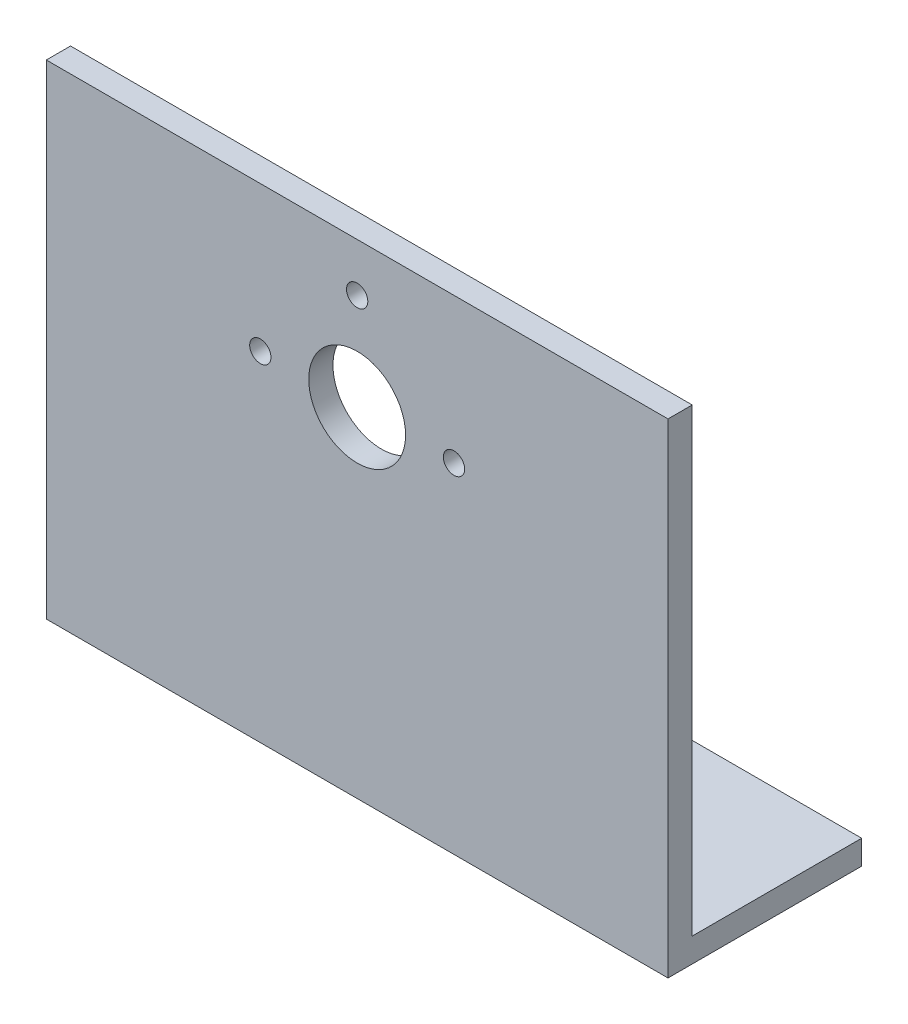
ISO-10303-21;
HEADER;
FILE_DESCRIPTION(('STEP AP214'),'2;1');
FILE_NAME('part.step','',(''),(''),'','','');
FILE_SCHEMA(('AUTOMOTIVE_DESIGN { 1 0 10303 214 1 1 1 1 }'));
ENDSEC;
DATA;
#1=APPLICATION_CONTEXT('core data for automotive mechanical design processes');
#2=APPLICATION_PROTOCOL_DEFINITION('international standard','automotive_design',2000,#1);
#3=PRODUCT_CONTEXT('',#1,'mechanical');
#4=PRODUCT('Part','Part','',(#3));
#5=PRODUCT_RELATED_PRODUCT_CATEGORY('part','',(#4));
#6=PRODUCT_DEFINITION_FORMATION('','',#4);
#7=PRODUCT_DEFINITION_CONTEXT('part definition',#1,'design');
#8=PRODUCT_DEFINITION('design','',#6,#7);
#9=PRODUCT_DEFINITION_SHAPE('','',#8);
#10=(LENGTH_UNIT() NAMED_UNIT(*) SI_UNIT(.MILLI.,.METRE.));
#11=(NAMED_UNIT(*) PLANE_ANGLE_UNIT() SI_UNIT($,.RADIAN.));
#12=(NAMED_UNIT(*) SI_UNIT($,.STERADIAN.) SOLID_ANGLE_UNIT());
#13=UNCERTAINTY_MEASURE_WITH_UNIT(LENGTH_MEASURE(1.E-05),#10,'distance_accuracy_value','');
#14=(GEOMETRIC_REPRESENTATION_CONTEXT(3) GLOBAL_UNCERTAINTY_ASSIGNED_CONTEXT((#13)) GLOBAL_UNIT_ASSIGNED_CONTEXT((#10,
#11,#12)) REPRESENTATION_CONTEXT('',''));
#15=CARTESIAN_POINT('',(0.,0.,0.));
#16=DIRECTION('',(0.,0.,1.));
#17=DIRECTION('',(1.,0.,0.));
#18=AXIS2_PLACEMENT_3D('',#15,#16,#17);
#19=CARTESIAN_POINT('',(-40.7657771127717,-44.45,3.175));
#20=DIRECTION('',(0.,0.,-1.));
#21=DIRECTION('',(-1.,0.,0.));
#22=AXIS2_PLACEMENT_3D('',#19,#20,#21);
#23=PLANE('',#22);
#24=CARTESIAN_POINT('',(-12.7,0.,3.175));
#25=DIRECTION('',(0.,0.,1.));
#26=DIRECTION('',(1.,0.,0.));
#27=AXIS2_PLACEMENT_3D('',#24,#25,#26);
#28=CIRCLE('',#27,1.397);
#29=CARTESIAN_POINT('',(-11.303,0.,3.175));
#30=VERTEX_POINT('',#29);
#31=EDGE_CURVE('E149',#30,#30,#28,.T.);
#32=ORIENTED_EDGE('',*,*,#31,.F.);
#33=EDGE_LOOP('',(#32));
#34=FACE_BOUND('',#33,.T.);
#35=CARTESIAN_POINT('',(0.,0.,3.175));
#36=DIRECTION('',(0.,0.,1.));
#37=DIRECTION('',(1.,0.,0.));
#38=AXIS2_PLACEMENT_3D('',#35,#36,#37);
#39=CIRCLE('',#38,6.35);
#40=CARTESIAN_POINT('',(6.35,0.,3.175));
#41=VERTEX_POINT('',#40);
#42=EDGE_CURVE('E161',#41,#41,#39,.T.);
#43=ORIENTED_EDGE('',*,*,#42,.F.);
#44=EDGE_LOOP('',(#43));
#45=FACE_BOUND('',#44,.T.);
#46=DIRECTION('',(0.,-1.,0.));
#47=VECTOR('',#46,1.);
#48=CARTESIAN_POINT('',(-40.7657771127717,19.0500000000001,3.175));
#49=LINE('',#48,#47);
#50=CARTESIAN_POINT('',(-40.7657771127717,19.0500000000001,3.175));
#51=VERTEX_POINT('',#50);
#52=CARTESIAN_POINT('',(-40.7657771127717,-44.45,3.175));
#53=VERTEX_POINT('',#52);
#54=EDGE_CURVE('E167',#51,#53,#49,.T.);
#55=ORIENTED_EDGE('',*,*,#54,.T.);
#56=DIRECTION('',(1.,0.,0.));
#57=VECTOR('',#56,1.);
#58=CARTESIAN_POINT('',(40.7657771127717,-44.45,3.175));
#59=LINE('',#58,#57);
#60=CARTESIAN_POINT('',(40.7657771127717,-44.45,3.175));
#61=VERTEX_POINT('',#60);
#62=EDGE_CURVE('E81',#53,#61,#59,.T.);
#63=ORIENTED_EDGE('',*,*,#62,.T.);
#64=DIRECTION('',(0.,1.,0.));
#65=VECTOR('',#64,1.);
#66=CARTESIAN_POINT('',(40.7657771127717,19.0500000000001,3.175));
#67=LINE('',#66,#65);
#68=CARTESIAN_POINT('',(40.7657771127717,19.0500000000001,3.175));
#69=VERTEX_POINT('',#68);
#70=EDGE_CURVE('E103',#61,#69,#67,.T.);
#71=ORIENTED_EDGE('',*,*,#70,.T.);
#72=DIRECTION('',(-1.,0.,0.));
#73=VECTOR('',#72,1.);
#74=CARTESIAN_POINT('',(40.7657771127717,19.0500000000001,3.175));
#75=LINE('',#74,#73);
#76=EDGE_CURVE('E59',#69,#51,#75,.T.);
#77=ORIENTED_EDGE('',*,*,#76,.T.);
#78=EDGE_LOOP('',(#55,#63,#71,#77));
#79=FACE_BOUND('',#78,.T.);
#80=CARTESIAN_POINT('',(0.,12.7,3.175));
#81=DIRECTION('',(0.,0.,1.));
#82=DIRECTION('',(1.,0.,0.));
#83=AXIS2_PLACEMENT_3D('',#80,#81,#82);
#84=CIRCLE('',#83,1.397);
#85=CARTESIAN_POINT('',(1.397,12.7,3.175));
#86=VERTEX_POINT('',#85);
#87=EDGE_CURVE('E155',#86,#86,#84,.T.);
#88=ORIENTED_EDGE('',*,*,#87,.F.);
#89=EDGE_LOOP('',(#88));
#90=FACE_BOUND('',#89,.T.);
#91=CARTESIAN_POINT('',(12.7,0.,3.175));
#92=DIRECTION('',(0.,0.,1.));
#93=DIRECTION('',(1.,0.,0.));
#94=AXIS2_PLACEMENT_3D('',#91,#92,#93);
#95=CIRCLE('',#94,1.397);
#96=CARTESIAN_POINT('',(14.097,0.,3.175));
#97=VERTEX_POINT('',#96);
#98=EDGE_CURVE('E129',#97,#97,#95,.T.);
#99=ORIENTED_EDGE('',*,*,#98,.F.);
#100=EDGE_LOOP('',(#99));
#101=FACE_BOUND('',#100,.T.);
#102=ADVANCED_FACE('F33',(#34,#45,#79,#90,#101),#23,.F.);
#103=CARTESIAN_POINT('',(-40.7657771127717,-44.45,0.));
#104=DIRECTION('',(0.,0.,-1.));
#105=DIRECTION('',(-1.,0.,0.));
#106=AXIS2_PLACEMENT_3D('',#103,#104,#105);
#107=PLANE('',#106);
#108=DIRECTION('',(1.,0.,0.));
#109=VECTOR('',#108,1.);
#110=CARTESIAN_POINT('',(40.7657771127717,-41.275,0.));
#111=LINE('',#110,#109);
#112=CARTESIAN_POINT('',(-40.7657771127717,-41.275,0.));
#113=VERTEX_POINT('',#112);
#114=CARTESIAN_POINT('',(40.7657771127717,-41.275,0.));
#115=VERTEX_POINT('',#114);
#116=EDGE_CURVE('E50',#113,#115,#111,.T.);
#117=ORIENTED_EDGE('',*,*,#116,.F.);
#118=DIRECTION('',(0.,-1.,0.));
#119=VECTOR('',#118,1.);
#120=CARTESIAN_POINT('',(-40.7657771127717,19.0500000000001,0.));
#121=LINE('',#120,#119);
#122=CARTESIAN_POINT('',(-40.7657771127717,19.0500000000001,0.));
#123=VERTEX_POINT('',#122);
#124=EDGE_CURVE('E164',#123,#113,#121,.T.);
#125=ORIENTED_EDGE('',*,*,#124,.F.);
#126=DIRECTION('',(-1.,0.,0.));
#127=VECTOR('',#126,1.);
#128=CARTESIAN_POINT('',(40.7657771127717,19.0500000000001,0.));
#129=LINE('',#128,#127);
#130=CARTESIAN_POINT('',(40.7657771127717,19.0500000000001,0.));
#131=VERTEX_POINT('',#130);
#132=EDGE_CURVE('E74',#131,#123,#129,.T.);
#133=ORIENTED_EDGE('',*,*,#132,.F.);
#134=DIRECTION('',(0.,1.,0.));
#135=VECTOR('',#134,1.);
#136=CARTESIAN_POINT('',(40.7657771127717,19.0500000000001,0.));
#137=LINE('',#136,#135);
#138=EDGE_CURVE('E133',#115,#131,#137,.T.);
#139=ORIENTED_EDGE('',*,*,#138,.F.);
#140=EDGE_LOOP('',(#117,#125,#133,#139));
#141=FACE_BOUND('',#140,.T.);
#142=CARTESIAN_POINT('',(-12.7,0.,0.));
#143=DIRECTION('',(0.,0.,1.));
#144=DIRECTION('',(1.,0.,0.));
#145=AXIS2_PLACEMENT_3D('',#142,#143,#144);
#146=CIRCLE('',#145,1.397);
#147=CARTESIAN_POINT('',(-11.303,0.,0.));
#148=VERTEX_POINT('',#147);
#149=EDGE_CURVE('E147',#148,#148,#146,.T.);
#150=ORIENTED_EDGE('',*,*,#149,.T.);
#151=EDGE_LOOP('',(#150));
#152=FACE_BOUND('',#151,.T.);
#153=CARTESIAN_POINT('',(0.,0.,0.));
#154=DIRECTION('',(0.,0.,1.));
#155=DIRECTION('',(1.,0.,0.));
#156=AXIS2_PLACEMENT_3D('',#153,#154,#155);
#157=CIRCLE('',#156,6.35);
#158=CARTESIAN_POINT('',(6.35,0.,0.));
#159=VERTEX_POINT('',#158);
#160=EDGE_CURVE('E158',#159,#159,#157,.T.);
#161=ORIENTED_EDGE('',*,*,#160,.T.);
#162=EDGE_LOOP('',(#161));
#163=FACE_BOUND('',#162,.T.);
#164=CARTESIAN_POINT('',(0.,12.7,0.));
#165=DIRECTION('',(0.,0.,1.));
#166=DIRECTION('',(1.,0.,0.));
#167=AXIS2_PLACEMENT_3D('',#164,#165,#166);
#168=CIRCLE('',#167,1.397);
#169=CARTESIAN_POINT('',(1.397,12.7,0.));
#170=VERTEX_POINT('',#169);
#171=EDGE_CURVE('E152',#170,#170,#168,.T.);
#172=ORIENTED_EDGE('',*,*,#171,.T.);
#173=EDGE_LOOP('',(#172));
#174=FACE_BOUND('',#173,.T.);
#175=CARTESIAN_POINT('',(12.7,0.,0.));
#176=DIRECTION('',(0.,0.,1.));
#177=DIRECTION('',(1.,0.,0.));
#178=AXIS2_PLACEMENT_3D('',#175,#176,#177);
#179=CIRCLE('',#178,1.397);
#180=CARTESIAN_POINT('',(14.097,0.,0.));
#181=VERTEX_POINT('',#180);
#182=EDGE_CURVE('E140',#181,#181,#179,.T.);
#183=ORIENTED_EDGE('',*,*,#182,.T.);
#184=EDGE_LOOP('',(#183));
#185=FACE_BOUND('',#184,.T.);
#186=ADVANCED_FACE('F179',(#141,#152,#163,#174,#185),#107,.T.);
#187=CARTESIAN_POINT('',(-40.7657771127717,19.0500000000001,3.175));
#188=DIRECTION('',(1.,0.,0.));
#189=DIRECTION('',(0.,1.,0.));
#190=AXIS2_PLACEMENT_3D('',#187,#188,#189);
#191=PLANE('',#190);
#192=ORIENTED_EDGE('',*,*,#124,.T.);
#193=DIRECTION('',(0.,0.,1.));
#194=VECTOR('',#193,1.);
#195=CARTESIAN_POINT('',(-40.7657771127717,-41.275,-22.225));
#196=LINE('',#195,#194);
#197=CARTESIAN_POINT('',(-40.7657771127717,-41.275,-22.225));
#198=VERTEX_POINT('',#197);
#199=EDGE_CURVE('E137',#198,#113,#196,.T.);
#200=ORIENTED_EDGE('',*,*,#199,.F.);
#201=DIRECTION('',(0.,1.,0.));
#202=VECTOR('',#201,1.);
#203=CARTESIAN_POINT('',(-40.7657771127717,-44.45,-22.225));
#204=LINE('',#203,#202);
#205=CARTESIAN_POINT('',(-40.7657771127717,-44.45,-22.225));
#206=VERTEX_POINT('',#205);
#207=EDGE_CURVE('E112',#206,#198,#204,.T.);
#208=ORIENTED_EDGE('',*,*,#207,.F.);
#209=DIRECTION('',(0.,0.,-1.));
#210=VECTOR('',#209,1.);
#211=CARTESIAN_POINT('',(-40.7657771127717,-44.45,3.175));
#212=LINE('',#211,#210);
#213=EDGE_CURVE('E11',#53,#206,#212,.T.);
#214=ORIENTED_EDGE('',*,*,#213,.F.);
#215=ORIENTED_EDGE('',*,*,#54,.F.);
#216=DIRECTION('',(0.,0.,-1.));
#217=VECTOR('',#216,1.);
#218=CARTESIAN_POINT('',(-40.7657771127717,19.0500000000001,3.175));
#219=LINE('',#218,#217);
#220=EDGE_CURVE('E172',#51,#123,#219,.T.);
#221=ORIENTED_EDGE('',*,*,#220,.T.);
#222=EDGE_LOOP('',(#192,#200,#208,#214,#215,#221));
#223=FACE_BOUND('',#222,.T.);
#224=ADVANCED_FACE('F35',(#223),#191,.F.);
#225=CARTESIAN_POINT('',(40.7657771127717,-44.45,3.175));
#226=DIRECTION('',(0.,1.,0.));
#227=DIRECTION('',(-1.,0.,0.));
#228=AXIS2_PLACEMENT_3D('',#225,#226,#227);
#229=PLANE('',#228);
#230=CARTESIAN_POINT('',(19.05,-44.4499999999999,-17.78));
#231=DIRECTION('',(0.,1.,0.));
#232=DIRECTION('',(-1.,0.,0.));
#233=AXIS2_PLACEMENT_3D('',#230,#231,#232);
#234=CIRCLE('',#233,1.397);
#235=CARTESIAN_POINT('',(19.05,-44.4500000000003,-16.383));
#236=VERTEX_POINT('',#235);
#237=EDGE_CURVE('E228',#236,#236,#234,.T.);
#238=ORIENTED_EDGE('',*,*,#237,.T.);
#239=EDGE_LOOP('',(#238));
#240=FACE_BOUND('',#239,.T.);
#241=CARTESIAN_POINT('',(-19.05,-44.4499999999999,-17.78));
#242=DIRECTION('',(0.,1.,0.));
#243=DIRECTION('',(-1.,0.,0.));
#244=AXIS2_PLACEMENT_3D('',#241,#242,#243);
#245=CIRCLE('',#244,1.397);
#246=CARTESIAN_POINT('',(-19.05,-44.4500000000003,-16.383));
#247=VERTEX_POINT('',#246);
#248=EDGE_CURVE('E119',#247,#247,#245,.T.);
#249=ORIENTED_EDGE('',*,*,#248,.T.);
#250=EDGE_LOOP('',(#249));
#251=FACE_BOUND('',#250,.T.);
#252=ORIENTED_EDGE('',*,*,#213,.T.);
#253=DIRECTION('',(-1.,0.,0.));
#254=VECTOR('',#253,1.);
#255=CARTESIAN_POINT('',(40.7657771127717,-44.45,-22.225));
#256=LINE('',#255,#254);
#257=CARTESIAN_POINT('',(40.7657771127717,-44.45,-22.225));
#258=VERTEX_POINT('',#257);
#259=EDGE_CURVE('E107',#258,#206,#256,.T.);
#260=ORIENTED_EDGE('',*,*,#259,.F.);
#261=DIRECTION('',(0.,0.,-1.));
#262=VECTOR('',#261,1.);
#263=CARTESIAN_POINT('',(40.7657771127717,-44.45,3.175));
#264=LINE('',#263,#262);
#265=EDGE_CURVE('E42',#61,#258,#264,.T.);
#266=ORIENTED_EDGE('',*,*,#265,.F.);
#267=ORIENTED_EDGE('',*,*,#62,.F.);
#268=EDGE_LOOP('',(#252,#260,#266,#267));
#269=FACE_BOUND('',#268,.T.);
#270=ADVANCED_FACE('F108',(#240,#251,#269),#229,.F.);
#271=CARTESIAN_POINT('',(40.7657771127717,19.0500000000001,3.175));
#272=DIRECTION('',(-1.,0.,0.));
#273=DIRECTION('',(0.,-1.,0.));
#274=AXIS2_PLACEMENT_3D('',#271,#272,#273);
#275=PLANE('',#274);
#276=ORIENTED_EDGE('',*,*,#265,.T.);
#277=DIRECTION('',(0.,-1.,0.));
#278=VECTOR('',#277,1.);
#279=CARTESIAN_POINT('',(40.7657771127717,-44.45,-22.225));
#280=LINE('',#279,#278);
#281=CARTESIAN_POINT('',(40.7657771127717,-41.275,-22.225));
#282=VERTEX_POINT('',#281);
#283=EDGE_CURVE('E101',#282,#258,#280,.T.);
#284=ORIENTED_EDGE('',*,*,#283,.F.);
#285=DIRECTION('',(0.,0.,1.));
#286=VECTOR('',#285,1.);
#287=CARTESIAN_POINT('',(40.7657771127717,-41.275,-22.225));
#288=LINE('',#287,#286);
#289=EDGE_CURVE('E126',#282,#115,#288,.T.);
#290=ORIENTED_EDGE('',*,*,#289,.T.);
#291=ORIENTED_EDGE('',*,*,#138,.T.);
#292=DIRECTION('',(0.,0.,-1.));
#293=VECTOR('',#292,1.);
#294=CARTESIAN_POINT('',(40.7657771127717,19.0500000000001,3.175));
#295=LINE('',#294,#293);
#296=EDGE_CURVE('E104',#69,#131,#295,.T.);
#297=ORIENTED_EDGE('',*,*,#296,.F.);
#298=ORIENTED_EDGE('',*,*,#70,.F.);
#299=EDGE_LOOP('',(#276,#284,#290,#291,#297,#298));
#300=FACE_BOUND('',#299,.T.);
#301=ADVANCED_FACE('F98',(#300),#275,.F.);
#302=CARTESIAN_POINT('',(40.7657771127717,19.0500000000001,3.175));
#303=DIRECTION('',(0.,-1.,0.));
#304=DIRECTION('',(1.,0.,0.));
#305=AXIS2_PLACEMENT_3D('',#302,#303,#304);
#306=PLANE('',#305);
#307=ORIENTED_EDGE('',*,*,#132,.T.);
#308=ORIENTED_EDGE('',*,*,#220,.F.);
#309=ORIENTED_EDGE('',*,*,#76,.F.);
#310=ORIENTED_EDGE('',*,*,#296,.T.);
#311=EDGE_LOOP('',(#307,#308,#309,#310));
#312=FACE_BOUND('',#311,.T.);
#313=ADVANCED_FACE('F178',(#312),#306,.F.);
#314=CARTESIAN_POINT('',(0.,0.,3.175));
#315=DIRECTION('',(0.,0.,-1.));
#316=DIRECTION('',(-1.,0.,0.));
#317=AXIS2_PLACEMENT_3D('',#314,#315,#316);
#318=CYLINDRICAL_SURFACE('',#317,6.35);
#319=ORIENTED_EDGE('',*,*,#42,.T.);
#320=EDGE_LOOP('',(#319));
#321=FACE_BOUND('',#320,.T.);
#322=ORIENTED_EDGE('',*,*,#160,.F.);
#323=EDGE_LOOP('',(#322));
#324=FACE_BOUND('',#323,.T.);
#325=ADVANCED_FACE('F210',(#321,#324),#318,.F.);
#326=CARTESIAN_POINT('',(0.,12.7,3.175));
#327=DIRECTION('',(0.,0.,-1.));
#328=DIRECTION('',(-1.,0.,0.));
#329=AXIS2_PLACEMENT_3D('',#326,#327,#328);
#330=CYLINDRICAL_SURFACE('',#329,1.397);
#331=ORIENTED_EDGE('',*,*,#87,.T.);
#332=EDGE_LOOP('',(#331));
#333=FACE_BOUND('',#332,.T.);
#334=ORIENTED_EDGE('',*,*,#171,.F.);
#335=EDGE_LOOP('',(#334));
#336=FACE_BOUND('',#335,.T.);
#337=ADVANCED_FACE('F203',(#333,#336),#330,.F.);
#338=CARTESIAN_POINT('',(-12.7,0.,3.175));
#339=DIRECTION('',(0.,0.,-1.));
#340=DIRECTION('',(-1.,0.,0.));
#341=AXIS2_PLACEMENT_3D('',#338,#339,#340);
#342=CYLINDRICAL_SURFACE('',#341,1.397);
#343=ORIENTED_EDGE('',*,*,#31,.T.);
#344=EDGE_LOOP('',(#343));
#345=FACE_BOUND('',#344,.T.);
#346=ORIENTED_EDGE('',*,*,#149,.F.);
#347=EDGE_LOOP('',(#346));
#348=FACE_BOUND('',#347,.T.);
#349=ADVANCED_FACE('F195',(#345,#348),#342,.F.);
#350=CARTESIAN_POINT('',(12.7,0.,3.175));
#351=DIRECTION('',(0.,0.,-1.));
#352=DIRECTION('',(-1.,0.,0.));
#353=AXIS2_PLACEMENT_3D('',#350,#351,#352);
#354=CYLINDRICAL_SURFACE('',#353,1.397);
#355=ORIENTED_EDGE('',*,*,#98,.T.);
#356=EDGE_LOOP('',(#355));
#357=FACE_BOUND('',#356,.T.);
#358=ORIENTED_EDGE('',*,*,#182,.F.);
#359=EDGE_LOOP('',(#358));
#360=FACE_BOUND('',#359,.T.);
#361=ADVANCED_FACE('F191',(#357,#360),#354,.F.);
#362=CARTESIAN_POINT('',(40.7657771127717,-41.275,-22.225));
#363=DIRECTION('',(0.,-1.,0.));
#364=DIRECTION('',(0.,0.,-1.));
#365=AXIS2_PLACEMENT_3D('',#362,#363,#364);
#366=PLANE('',#365);
#367=CARTESIAN_POINT('',(19.05,-41.275,-17.78));
#368=DIRECTION('',(0.,1.,0.));
#369=DIRECTION('',(0.,0.,1.));
#370=AXIS2_PLACEMENT_3D('',#367,#368,#369);
#371=CIRCLE('',#370,1.397);
#372=CARTESIAN_POINT('',(19.05,-41.2749999999997,-16.383));
#373=VERTEX_POINT('',#372);
#374=EDGE_CURVE('E236',#373,#373,#371,.T.);
#375=ORIENTED_EDGE('',*,*,#374,.F.);
#376=EDGE_LOOP('',(#375));
#377=FACE_BOUND('',#376,.T.);
#378=CARTESIAN_POINT('',(-19.05,-41.275,-17.78));
#379=DIRECTION('',(0.,1.,0.));
#380=DIRECTION('',(0.,0.,1.));
#381=AXIS2_PLACEMENT_3D('',#378,#379,#380);
#382=CIRCLE('',#381,1.397);
#383=CARTESIAN_POINT('',(-19.05,-41.2749999999997,-16.383));
#384=VERTEX_POINT('',#383);
#385=EDGE_CURVE('E232',#384,#384,#382,.T.);
#386=ORIENTED_EDGE('',*,*,#385,.F.);
#387=EDGE_LOOP('',(#386));
#388=FACE_BOUND('',#387,.T.);
#389=ORIENTED_EDGE('',*,*,#116,.T.);
#390=ORIENTED_EDGE('',*,*,#289,.F.);
#391=DIRECTION('',(1.,0.,0.));
#392=VECTOR('',#391,1.);
#393=CARTESIAN_POINT('',(40.7657771127717,-41.275,-22.225));
#394=LINE('',#393,#392);
#395=EDGE_CURVE('E116',#198,#282,#394,.T.);
#396=ORIENTED_EDGE('',*,*,#395,.F.);
#397=ORIENTED_EDGE('',*,*,#199,.T.);
#398=EDGE_LOOP('',(#389,#390,#396,#397));
#399=FACE_BOUND('',#398,.T.);
#400=ADVANCED_FACE('F194',(#377,#388,#399),#366,.F.);
#401=CARTESIAN_POINT('',(40.7657771127717,-41.275,-22.225));
#402=DIRECTION('',(0.,0.,1.));
#403=DIRECTION('',(1.,0.,0.));
#404=AXIS2_PLACEMENT_3D('',#401,#402,#403);
#405=PLANE('',#404);
#406=ORIENTED_EDGE('',*,*,#283,.T.);
#407=ORIENTED_EDGE('',*,*,#259,.T.);
#408=ORIENTED_EDGE('',*,*,#207,.T.);
#409=ORIENTED_EDGE('',*,*,#395,.T.);
#410=EDGE_LOOP('',(#406,#407,#408,#409));
#411=FACE_BOUND('',#410,.T.);
#412=ADVANCED_FACE('F114',(#411),#405,.F.);
#413=CARTESIAN_POINT('',(-19.05,-3216.275,-17.78));
#414=DIRECTION('',(0.,1.,0.));
#415=DIRECTION('',(0.,0.,1.));
#416=AXIS2_PLACEMENT_3D('',#413,#414,#415);
#417=CYLINDRICAL_SURFACE('',#416,1.397);
#418=CARTESIAN_POINT('',(-19.05,-41.2749999999997,-16.383));
#419=CARTESIAN_POINT('',(-19.05,-41.3080729166664,-16.383));
#420=CARTESIAN_POINT('',(-19.05,-41.341145833333,-16.383));
#421=CARTESIAN_POINT('',(-19.05,-41.4072916666663,-16.383));
#422=CARTESIAN_POINT('',(-19.05,-41.440364583333,-16.383));
#423=CARTESIAN_POINT('',(-19.05,-41.5065104166663,-16.383));
#424=CARTESIAN_POINT('',(-19.05,-41.539583333333,-16.383));
#425=CARTESIAN_POINT('',(-19.05,-41.6057291666663,-16.383));
#426=CARTESIAN_POINT('',(-19.05,-41.6388020833329,-16.383));
#427=CARTESIAN_POINT('',(-19.05,-41.7049479166664,-16.383));
#428=CARTESIAN_POINT('',(-19.05,-41.7380208333332,-16.383));
#429=CARTESIAN_POINT('',(-19.05,-41.8041666666666,-16.383));
#430=CARTESIAN_POINT('',(-19.05,-41.8372395833333,-16.383));
#431=CARTESIAN_POINT('',(-19.05,-41.9033854166666,-16.383));
#432=CARTESIAN_POINT('',(-19.05,-41.9364583333333,-16.383));
#433=CARTESIAN_POINT('',(-19.05,-42.0026041666666,-16.383));
#434=CARTESIAN_POINT('',(-19.05,-42.0356770833332,-16.383));
#435=CARTESIAN_POINT('',(-19.05,-42.1018229166665,-16.383));
#436=CARTESIAN_POINT('',(-19.05,-42.1348958333332,-16.383));
#437=CARTESIAN_POINT('',(-19.05,-42.2010416666665,-16.383));
#438=CARTESIAN_POINT('',(-19.05,-42.2341145833332,-16.383));
#439=CARTESIAN_POINT('',(-19.05,-42.3002604166665,-16.383));
#440=CARTESIAN_POINT('',(-19.05,-42.3333333333331,-16.383));
#441=CARTESIAN_POINT('',(-19.05,-42.3994791666666,-16.383));
#442=CARTESIAN_POINT('',(-19.05,-42.4325520833334,-16.383));
#443=CARTESIAN_POINT('',(-19.05,-42.4986979166668,-16.383));
#444=CARTESIAN_POINT('',(-19.05,-42.5317708333335,-16.383));
#445=CARTESIAN_POINT('',(-19.05,-42.5979166666668,-16.383));
#446=CARTESIAN_POINT('',(-19.05,-42.6309895833334,-16.383));
#447=CARTESIAN_POINT('',(-19.05,-42.6971354166668,-16.383));
#448=CARTESIAN_POINT('',(-19.05,-42.7302083333334,-16.383));
#449=CARTESIAN_POINT('',(-19.05,-42.7963541666667,-16.383));
#450=CARTESIAN_POINT('',(-19.05,-42.8294270833334,-16.383));
#451=CARTESIAN_POINT('',(-19.05,-42.8955729166667,-16.383));
#452=CARTESIAN_POINT('',(-19.05,-42.9286458333333,-16.383));
#453=CARTESIAN_POINT('',(-19.05,-42.9947916666666,-16.383));
#454=CARTESIAN_POINT('',(-19.05,-43.0278645833333,-16.383));
#455=CARTESIAN_POINT('',(-19.05,-43.0940104166666,-16.383));
#456=CARTESIAN_POINT('',(-19.05,-43.1270833333333,-16.383));
#457=CARTESIAN_POINT('',(-19.05,-43.1932291666666,-16.383));
#458=CARTESIAN_POINT('',(-19.05,-43.2263020833332,-16.383));
#459=CARTESIAN_POINT('',(-19.05,-43.2924479166667,-16.383));
#460=CARTESIAN_POINT('',(-19.05,-43.3255208333335,-16.383));
#461=CARTESIAN_POINT('',(-19.05,-43.3916666666669,-16.383));
#462=CARTESIAN_POINT('',(-19.05,-43.4247395833336,-16.383));
#463=CARTESIAN_POINT('',(-19.05,-43.4908854166669,-16.383));
#464=CARTESIAN_POINT('',(-19.05,-43.5239583333336,-16.383));
#465=CARTESIAN_POINT('',(-19.05,-43.5901041666669,-16.383));
#466=CARTESIAN_POINT('',(-19.05,-43.6231770833335,-16.383));
#467=CARTESIAN_POINT('',(-19.05,-43.6893229166668,-16.383));
#468=CARTESIAN_POINT('',(-19.05,-43.7223958333335,-16.383));
#469=CARTESIAN_POINT('',(-19.05,-43.7885416666668,-16.383));
#470=CARTESIAN_POINT('',(-19.05,-43.8216145833334,-16.383));
#471=CARTESIAN_POINT('',(-19.05,-43.8877604166668,-16.383));
#472=CARTESIAN_POINT('',(-19.05,-43.9208333333334,-16.383));
#473=CARTESIAN_POINT('',(-19.05,-43.9869791666669,-16.383));
#474=CARTESIAN_POINT('',(-19.05,-44.0200520833337,-16.383));
#475=CARTESIAN_POINT('',(-19.05,-44.0861979166671,-16.383));
#476=CARTESIAN_POINT('',(-19.05,-44.1192708333338,-16.383));
#477=CARTESIAN_POINT('',(-19.05,-44.1854166666671,-16.383));
#478=CARTESIAN_POINT('',(-19.05,-44.2184895833337,-16.383));
#479=CARTESIAN_POINT('',(-19.05,-44.2846354166671,-16.383));
#480=CARTESIAN_POINT('',(-19.05,-44.3177083333337,-16.383));
#481=CARTESIAN_POINT('',(-19.05,-44.383854166667,-16.383));
#482=CARTESIAN_POINT('',(-19.05,-44.4169270833337,-16.383));
#483=CARTESIAN_POINT('',(-19.05,-44.4500000000003,-16.383));
#484=B_SPLINE_CURVE_WITH_KNOTS('',3,(#418,#419,#420,#421,#422,#423,#424,#425,#426,#427,#428,
#429,#430,#431,#432,#433,#434,#435,#436,#437,#438,#439,#440,#441,#442,#443,#444,#445,#446,#447,
#448,#449,#450,#451,#452,#453,#454,#455,#456,#457,#458,#459,#460,#461,#462,#463,#464,#465,#466,
#467,#468,#469,#470,#471,#472,#473,#474,#475,#476,#477,#478,#479,#480,#481,#482,#483),
.UNSPECIFIED.,.F.,.F.,(4,2,2,2,2,2,2,2,2,2,2,2,2,2,2,2,2,2,2,2,2,2,2,2,2,2,2,2,2,2,2,2,4),(0.,
0.0992187499999631,0.198437499999926,0.297656249999889,0.396874999999852,0.496093750000259,
0.595312500000222,0.694531250000185,0.793750000000149,0.892968750000112,0.992187500000075,
1.09140625000004,1.19062500000044,1.28984375000041,1.38906250000037,1.48828125000033,
1.5875000000003,1.68671875000026,1.78593750000022,1.88515625000019,1.98437500000015,
2.08359375000056,2.18281250000052,2.28203125000048,2.38125000000045,2.48046875000041,
2.57968750000037,2.67890625000033,2.77812500000074,2.8773437500007,2.97656250000067,
3.07578125000063,3.17500000000059),.UNSPECIFIED.);
#485=EDGE_CURVE('BSEAM246',#384,#247,#484,.T.);
#486=ORIENTED_EDGE('',*,*,#385,.T.);
#487=ORIENTED_EDGE('',*,*,#248,.F.);
#488=ORIENTED_EDGE('',*,*,#485,.T.);
#489=ORIENTED_EDGE('',*,*,#485,.F.);
#490=EDGE_LOOP('',(#486,#488,#487,#489));
#491=FACE_BOUND('',#490,.T.);
#492=ADVANCED_FACE('F246',(#491),#417,.F.);
#493=CARTESIAN_POINT('',(19.05,-3216.275,-17.78));
#494=DIRECTION('',(0.,1.,0.));
#495=DIRECTION('',(0.,0.,1.));
#496=AXIS2_PLACEMENT_3D('',#493,#494,#495);
#497=CYLINDRICAL_SURFACE('',#496,1.397);
#498=CARTESIAN_POINT('',(19.05,-41.2749999999997,-16.383));
#499=CARTESIAN_POINT('',(19.05,-41.3080729166664,-16.383));
#500=CARTESIAN_POINT('',(19.05,-41.341145833333,-16.383));
#501=CARTESIAN_POINT('',(19.05,-41.4072916666663,-16.383));
#502=CARTESIAN_POINT('',(19.05,-41.440364583333,-16.383));
#503=CARTESIAN_POINT('',(19.05,-41.5065104166663,-16.383));
#504=CARTESIAN_POINT('',(19.05,-41.539583333333,-16.383));
#505=CARTESIAN_POINT('',(19.05,-41.6057291666663,-16.383));
#506=CARTESIAN_POINT('',(19.05,-41.6388020833329,-16.383));
#507=CARTESIAN_POINT('',(19.05,-41.7049479166664,-16.383));
#508=CARTESIAN_POINT('',(19.05,-41.7380208333332,-16.383));
#509=CARTESIAN_POINT('',(19.05,-41.8041666666666,-16.383));
#510=CARTESIAN_POINT('',(19.05,-41.8372395833333,-16.383));
#511=CARTESIAN_POINT('',(19.05,-41.9033854166666,-16.383));
#512=CARTESIAN_POINT('',(19.05,-41.9364583333333,-16.383));
#513=CARTESIAN_POINT('',(19.05,-42.0026041666666,-16.383));
#514=CARTESIAN_POINT('',(19.05,-42.0356770833332,-16.383));
#515=CARTESIAN_POINT('',(19.05,-42.1018229166665,-16.383));
#516=CARTESIAN_POINT('',(19.05,-42.1348958333332,-16.383));
#517=CARTESIAN_POINT('',(19.05,-42.2010416666665,-16.383));
#518=CARTESIAN_POINT('',(19.05,-42.2341145833332,-16.383));
#519=CARTESIAN_POINT('',(19.05,-42.3002604166665,-16.383));
#520=CARTESIAN_POINT('',(19.05,-42.3333333333331,-16.383));
#521=CARTESIAN_POINT('',(19.05,-42.3994791666666,-16.383));
#522=CARTESIAN_POINT('',(19.05,-42.4325520833334,-16.383));
#523=CARTESIAN_POINT('',(19.05,-42.4986979166668,-16.383));
#524=CARTESIAN_POINT('',(19.05,-42.5317708333335,-16.383));
#525=CARTESIAN_POINT('',(19.05,-42.5979166666668,-16.383));
#526=CARTESIAN_POINT('',(19.05,-42.6309895833334,-16.383));
#527=CARTESIAN_POINT('',(19.05,-42.6971354166668,-16.383));
#528=CARTESIAN_POINT('',(19.05,-42.7302083333334,-16.383));
#529=CARTESIAN_POINT('',(19.05,-42.7963541666667,-16.383));
#530=CARTESIAN_POINT('',(19.05,-42.8294270833334,-16.383));
#531=CARTESIAN_POINT('',(19.05,-42.8955729166667,-16.383));
#532=CARTESIAN_POINT('',(19.05,-42.9286458333333,-16.383));
#533=CARTESIAN_POINT('',(19.05,-42.9947916666666,-16.383));
#534=CARTESIAN_POINT('',(19.05,-43.0278645833333,-16.383));
#535=CARTESIAN_POINT('',(19.05,-43.0940104166666,-16.383));
#536=CARTESIAN_POINT('',(19.05,-43.1270833333333,-16.383));
#537=CARTESIAN_POINT('',(19.05,-43.1932291666666,-16.383));
#538=CARTESIAN_POINT('',(19.05,-43.2263020833332,-16.383));
#539=CARTESIAN_POINT('',(19.05,-43.2924479166667,-16.383));
#540=CARTESIAN_POINT('',(19.05,-43.3255208333335,-16.383));
#541=CARTESIAN_POINT('',(19.05,-43.3916666666669,-16.383));
#542=CARTESIAN_POINT('',(19.05,-43.4247395833336,-16.383));
#543=CARTESIAN_POINT('',(19.05,-43.4908854166669,-16.383));
#544=CARTESIAN_POINT('',(19.05,-43.5239583333336,-16.383));
#545=CARTESIAN_POINT('',(19.05,-43.5901041666669,-16.383));
#546=CARTESIAN_POINT('',(19.05,-43.6231770833335,-16.383));
#547=CARTESIAN_POINT('',(19.05,-43.6893229166668,-16.383));
#548=CARTESIAN_POINT('',(19.05,-43.7223958333335,-16.383));
#549=CARTESIAN_POINT('',(19.05,-43.7885416666668,-16.383));
#550=CARTESIAN_POINT('',(19.05,-43.8216145833334,-16.383));
#551=CARTESIAN_POINT('',(19.05,-43.8877604166668,-16.383));
#552=CARTESIAN_POINT('',(19.05,-43.9208333333334,-16.383));
#553=CARTESIAN_POINT('',(19.05,-43.9869791666669,-16.383));
#554=CARTESIAN_POINT('',(19.05,-44.0200520833337,-16.383));
#555=CARTESIAN_POINT('',(19.05,-44.0861979166671,-16.383));
#556=CARTESIAN_POINT('',(19.05,-44.1192708333338,-16.383));
#557=CARTESIAN_POINT('',(19.05,-44.1854166666671,-16.383));
#558=CARTESIAN_POINT('',(19.05,-44.2184895833337,-16.383));
#559=CARTESIAN_POINT('',(19.05,-44.2846354166671,-16.383));
#560=CARTESIAN_POINT('',(19.05,-44.3177083333337,-16.383));
#561=CARTESIAN_POINT('',(19.05,-44.383854166667,-16.383));
#562=CARTESIAN_POINT('',(19.05,-44.4169270833337,-16.383));
#563=CARTESIAN_POINT('',(19.05,-44.4500000000003,-16.383));
#564=B_SPLINE_CURVE_WITH_KNOTS('',3,(#498,#499,#500,#501,#502,#503,#504,#505,#506,#507,#508,
#509,#510,#511,#512,#513,#514,#515,#516,#517,#518,#519,#520,#521,#522,#523,#524,#525,#526,#527,
#528,#529,#530,#531,#532,#533,#534,#535,#536,#537,#538,#539,#540,#541,#542,#543,#544,#545,#546,
#547,#548,#549,#550,#551,#552,#553,#554,#555,#556,#557,#558,#559,#560,#561,#562,#563),
.UNSPECIFIED.,.F.,.F.,(4,2,2,2,2,2,2,2,2,2,2,2,2,2,2,2,2,2,2,2,2,2,2,2,2,2,2,2,2,2,2,2,4),(0.,
0.0992187499999631,0.198437499999926,0.297656249999889,0.396874999999852,0.496093750000259,
0.595312500000222,0.694531250000185,0.793750000000149,0.892968750000112,0.992187500000075,
1.09140625000004,1.19062500000044,1.28984375000041,1.38906250000037,1.48828125000033,
1.5875000000003,1.68671875000026,1.78593750000022,1.88515625000019,1.98437500000015,
2.08359375000056,2.18281250000052,2.28203125000048,2.38125000000045,2.48046875000041,
2.57968750000037,2.67890625000033,2.77812500000074,2.8773437500007,2.97656250000067,
3.07578125000063,3.17500000000059),.UNSPECIFIED.);
#565=EDGE_CURVE('BSEAM242',#373,#236,#564,.T.);
#566=ORIENTED_EDGE('',*,*,#374,.T.);
#567=ORIENTED_EDGE('',*,*,#237,.F.);
#568=ORIENTED_EDGE('',*,*,#565,.T.);
#569=ORIENTED_EDGE('',*,*,#565,.F.);
#570=EDGE_LOOP('',(#566,#568,#567,#569));
#571=FACE_BOUND('',#570,.T.);
#572=ADVANCED_FACE('F242',(#571),#497,.F.);
#573=CLOSED_SHELL('',(#102,#186,#224,#270,#301,#313,#325,#337,#349,#361,#400,#412,#492,#572));
#574=MANIFOLD_SOLID_BREP('B2',#573);
#575=ADVANCED_BREP_SHAPE_REPRESENTATION('',(#18,#574),#14);
#576=SHAPE_DEFINITION_REPRESENTATION(#9,#575);
ENDSEC;
END-ISO-10303-21;
